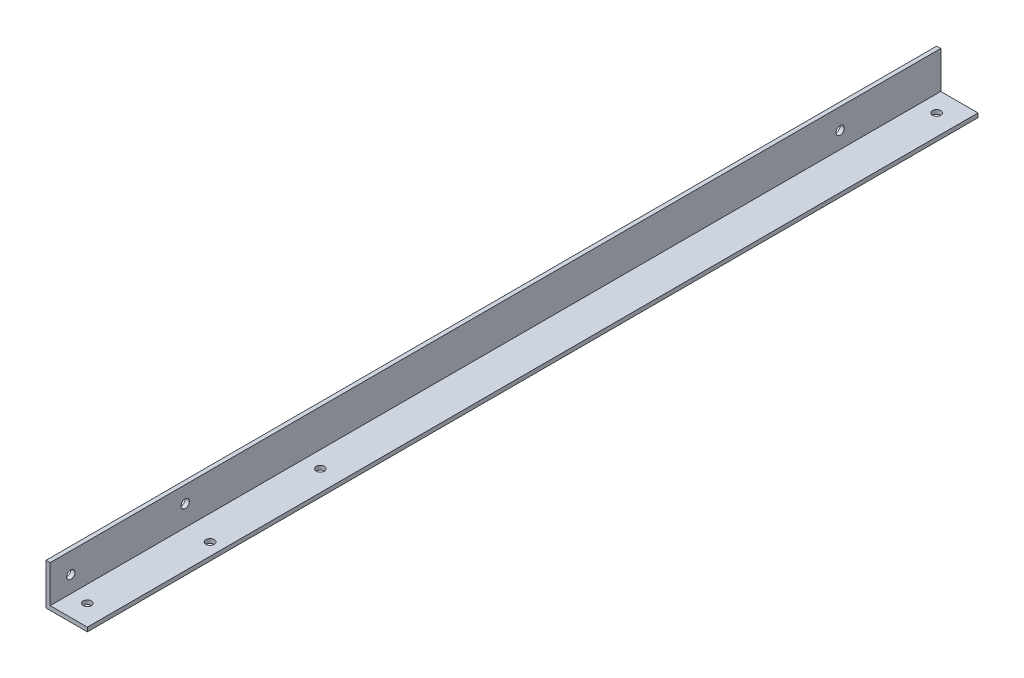
ISO-10303-21;
HEADER;
FILE_DESCRIPTION(('STEP AP214'),'2;1');
FILE_NAME('part.step','',(''),(''),'','','');
FILE_SCHEMA(('AUTOMOTIVE_DESIGN { 1 0 10303 214 1 1 1 1 }'));
ENDSEC;
DATA;
#1=APPLICATION_CONTEXT('core data for automotive mechanical design processes');
#2=APPLICATION_PROTOCOL_DEFINITION('international standard','automotive_design',2000,#1);
#3=PRODUCT_CONTEXT('',#1,'mechanical');
#4=PRODUCT('Part','Part','',(#3));
#5=PRODUCT_RELATED_PRODUCT_CATEGORY('part','',(#4));
#6=PRODUCT_DEFINITION_FORMATION('','',#4);
#7=PRODUCT_DEFINITION_CONTEXT('part definition',#1,'design');
#8=PRODUCT_DEFINITION('design','',#6,#7);
#9=PRODUCT_DEFINITION_SHAPE('','',#8);
#10=(LENGTH_UNIT() NAMED_UNIT(*) SI_UNIT(.MILLI.,.METRE.));
#11=(NAMED_UNIT(*) PLANE_ANGLE_UNIT() SI_UNIT($,.RADIAN.));
#12=(NAMED_UNIT(*) SI_UNIT($,.STERADIAN.) SOLID_ANGLE_UNIT());
#13=UNCERTAINTY_MEASURE_WITH_UNIT(LENGTH_MEASURE(1.E-05),#10,'distance_accuracy_value','');
#14=(GEOMETRIC_REPRESENTATION_CONTEXT(3) GLOBAL_UNCERTAINTY_ASSIGNED_CONTEXT((#13)) GLOBAL_UNIT_ASSIGNED_CONTEXT((#10,
#11,#12)) REPRESENTATION_CONTEXT('',''));
#15=CARTESIAN_POINT('',(0.,0.,0.));
#16=DIRECTION('',(0.,0.,1.));
#17=DIRECTION('',(1.,0.,0.));
#18=AXIS2_PLACEMENT_3D('',#15,#16,#17);
#19=CARTESIAN_POINT('',(-19.1133705903621,2.046,323.));
#20=DIRECTION('',(0.,-1.,0.));
#21=DIRECTION('',(1.,0.,0.));
#22=AXIS2_PLACEMENT_3D('',#19,#20,#21);
#23=PLANE('',#22);
#24=DIRECTION('',(-1.,0.,0.));
#25=VECTOR('',#24,1.);
#26=CARTESIAN_POINT('',(-19.1133705903621,2.046,0.));
#27=LINE('',#26,#25);
#28=CARTESIAN_POINT('',(-19.1133705903621,2.046,0.));
#29=VERTEX_POINT('',#28);
#30=CARTESIAN_POINT('',(-20.6133705903621,2.04600000000001,0.));
#31=VERTEX_POINT('',#30);
#32=EDGE_CURVE('E115',#29,#31,#27,.T.);
#33=ORIENTED_EDGE('',*,*,#32,.T.);
#34=DIRECTION('',(0.,0.,-1.));
#35=VECTOR('',#34,1.);
#36=CARTESIAN_POINT('',(-20.6133705903621,2.04600000000001,323.));
#37=LINE('',#36,#35);
#38=CARTESIAN_POINT('',(-20.6133705903621,2.04600000000001,323.));
#39=VERTEX_POINT('',#38);
#40=EDGE_CURVE('E11',#39,#31,#37,.T.);
#41=ORIENTED_EDGE('',*,*,#40,.F.);
#42=DIRECTION('',(-1.,0.,0.));
#43=VECTOR('',#42,1.);
#44=CARTESIAN_POINT('',(-19.1133705903621,2.046,323.));
#45=LINE('',#44,#43);
#46=CARTESIAN_POINT('',(-19.1133705903621,2.046,323.));
#47=VERTEX_POINT('',#46);
#48=EDGE_CURVE('E126',#47,#39,#45,.T.);
#49=ORIENTED_EDGE('',*,*,#48,.F.);
#50=DIRECTION('',(0.,0.,-1.));
#51=VECTOR('',#50,1.);
#52=CARTESIAN_POINT('',(-19.1133705903621,2.046,323.));
#53=LINE('',#52,#51);
#54=EDGE_CURVE('E111',#47,#29,#53,.T.);
#55=ORIENTED_EDGE('',*,*,#54,.T.);
#56=EDGE_LOOP('',(#33,#41,#49,#55));
#57=FACE_BOUND('',#56,.T.);
#58=ADVANCED_FACE('F31',(#57),#23,.F.);
#59=CARTESIAN_POINT('',(-20.6133705903621,2.04600000000001,323.));
#60=DIRECTION('',(1.,0.,0.));
#61=DIRECTION('',(0.,0.,-1.));
#62=AXIS2_PLACEMENT_3D('',#59,#60,#61);
#63=PLANE('',#62);
#64=CARTESIAN_POINT('',(-20.6133705903621,-5.454,315.5));
#65=DIRECTION('',(1.,0.,0.));
#66=DIRECTION('',(0.,0.,-1.));
#67=AXIS2_PLACEMENT_3D('',#64,#65,#66);
#68=CIRCLE('',#67,1.50000000000002);
#69=CARTESIAN_POINT('',(-20.6133705903621,-5.454,314.));
#70=VERTEX_POINT('',#69);
#71=EDGE_CURVE('E278',#70,#70,#68,.T.);
#72=ORIENTED_EDGE('',*,*,#71,.T.);
#73=EDGE_LOOP('',(#72));
#74=FACE_BOUND('',#73,.T.);
#75=CARTESIAN_POINT('',(-20.6133705903621,-3.954,274.));
#76=DIRECTION('',(1.,0.,0.));
#77=DIRECTION('',(0.,0.,-1.));
#78=AXIS2_PLACEMENT_3D('',#75,#76,#77);
#79=CIRCLE('',#78,1.50000000000002);
#80=CARTESIAN_POINT('',(-20.6133705903621,-3.954,272.5));
#81=VERTEX_POINT('',#80);
#82=EDGE_CURVE('E282',#81,#81,#79,.T.);
#83=ORIENTED_EDGE('',*,*,#82,.T.);
#84=EDGE_LOOP('',(#83));
#85=FACE_BOUND('',#84,.T.);
#86=CARTESIAN_POINT('',(-20.6133705903621,-5.454,36.5));
#87=DIRECTION('',(1.,0.,0.));
#88=DIRECTION('',(0.,0.,-1.));
#89=AXIS2_PLACEMENT_3D('',#86,#87,#88);
#90=CIRCLE('',#89,1.5);
#91=CARTESIAN_POINT('',(-20.6133705903621,-5.454,35.));
#92=VERTEX_POINT('',#91);
#93=EDGE_CURVE('E291',#92,#92,#90,.T.);
#94=ORIENTED_EDGE('',*,*,#93,.T.);
#95=EDGE_LOOP('',(#94));
#96=FACE_BOUND('',#95,.T.);
#97=DIRECTION('',(0.,-1.,0.));
#98=VECTOR('',#97,1.);
#99=CARTESIAN_POINT('',(-20.6133705903621,2.04600000000001,0.));
#100=LINE('',#99,#98);
#101=CARTESIAN_POINT('',(-20.6133705903621,-12.954,0.));
#102=VERTEX_POINT('',#101);
#103=EDGE_CURVE('E118',#31,#102,#100,.T.);
#104=ORIENTED_EDGE('',*,*,#103,.T.);
#105=DIRECTION('',(0.,0.,-1.));
#106=VECTOR('',#105,1.);
#107=CARTESIAN_POINT('',(-20.6133705903621,-12.954,323.));
#108=LINE('',#107,#106);
#109=CARTESIAN_POINT('',(-20.6133705903621,-12.954,323.));
#110=VERTEX_POINT('',#109);
#111=EDGE_CURVE('E39',#110,#102,#108,.T.);
#112=ORIENTED_EDGE('',*,*,#111,.F.);
#113=DIRECTION('',(0.,-1.,0.));
#114=VECTOR('',#113,1.);
#115=CARTESIAN_POINT('',(-20.6133705903621,2.04600000000001,323.));
#116=LINE('',#115,#114);
#117=EDGE_CURVE('E84',#39,#110,#116,.T.);
#118=ORIENTED_EDGE('',*,*,#117,.F.);
#119=ORIENTED_EDGE('',*,*,#40,.T.);
#120=EDGE_LOOP('',(#104,#112,#118,#119));
#121=FACE_BOUND('',#120,.T.);
#122=ADVANCED_FACE('F154',(#74,#85,#96,#121),#63,.F.);
#123=CARTESIAN_POINT('',(-20.6133705903621,-12.954,323.));
#124=DIRECTION('',(0.,1.,0.));
#125=DIRECTION('',(0.,0.,1.));
#126=AXIS2_PLACEMENT_3D('',#123,#124,#125);
#127=PLANE('',#126);
#128=CARTESIAN_POINT('',(-13.1133705903621,-12.954,231.));
#129=DIRECTION('',(0.,1.,0.));
#130=DIRECTION('',(0.,0.,1.));
#131=AXIS2_PLACEMENT_3D('',#128,#129,#130);
#132=CIRCLE('',#131,1.5);
#133=CARTESIAN_POINT('',(-13.1133705903621,-12.954,232.5));
#134=VERTEX_POINT('',#133);
#135=EDGE_CURVE('E297',#134,#134,#132,.T.);
#136=ORIENTED_EDGE('',*,*,#135,.T.);
#137=EDGE_LOOP('',(#136));
#138=FACE_BOUND('',#137,.T.);
#139=CARTESIAN_POINT('',(-10.1133705903621,-12.954,274.));
#140=DIRECTION('',(0.,1.,0.));
#141=DIRECTION('',(0.,0.,1.));
#142=AXIS2_PLACEMENT_3D('',#139,#140,#141);
#143=CIRCLE('',#142,1.5);
#144=CARTESIAN_POINT('',(-10.1133705903621,-12.954,275.5));
#145=VERTEX_POINT('',#144);
#146=EDGE_CURVE('E303',#145,#145,#143,.T.);
#147=ORIENTED_EDGE('',*,*,#146,.T.);
#148=EDGE_LOOP('',(#147));
#149=FACE_BOUND('',#148,.T.);
#150=CARTESIAN_POINT('',(-13.1133705903621,-12.954,315.5));
#151=DIRECTION('',(0.,1.,0.));
#152=DIRECTION('',(0.,0.,1.));
#153=AXIS2_PLACEMENT_3D('',#150,#151,#152);
#154=CIRCLE('',#153,1.5);
#155=CARTESIAN_POINT('',(-13.1133705903621,-12.954,317.));
#156=VERTEX_POINT('',#155);
#157=EDGE_CURVE('E309',#156,#156,#154,.T.);
#158=ORIENTED_EDGE('',*,*,#157,.T.);
#159=EDGE_LOOP('',(#158));
#160=FACE_BOUND('',#159,.T.);
#161=CARTESIAN_POINT('',(-13.1133705903621,-12.954,7.5));
#162=DIRECTION('',(0.,1.,0.));
#163=DIRECTION('',(0.,0.,1.));
#164=AXIS2_PLACEMENT_3D('',#161,#162,#163);
#165=CIRCLE('',#164,1.5);
#166=CARTESIAN_POINT('',(-13.1133705903621,-12.954,9.));
#167=VERTEX_POINT('',#166);
#168=EDGE_CURVE('E119',#167,#167,#165,.T.);
#169=ORIENTED_EDGE('',*,*,#168,.T.);
#170=EDGE_LOOP('',(#169));
#171=FACE_BOUND('',#170,.T.);
#172=DIRECTION('',(1.,0.,0.));
#173=VECTOR('',#172,1.);
#174=CARTESIAN_POINT('',(-20.6133705903621,-12.954,0.));
#175=LINE('',#174,#173);
#176=CARTESIAN_POINT('',(-5.61337059036206,-12.954,0.));
#177=VERTEX_POINT('',#176);
#178=EDGE_CURVE('E121',#102,#177,#175,.T.);
#179=ORIENTED_EDGE('',*,*,#178,.T.);
#180=DIRECTION('',(0.,0.,-1.));
#181=VECTOR('',#180,1.);
#182=CARTESIAN_POINT('',(-5.61337059036206,-12.954,323.));
#183=LINE('',#182,#181);
#184=CARTESIAN_POINT('',(-5.61337059036206,-12.954,323.));
#185=VERTEX_POINT('',#184);
#186=EDGE_CURVE('E106',#185,#177,#183,.T.);
#187=ORIENTED_EDGE('',*,*,#186,.F.);
#188=DIRECTION('',(1.,0.,0.));
#189=VECTOR('',#188,1.);
#190=CARTESIAN_POINT('',(-20.6133705903621,-12.954,323.));
#191=LINE('',#190,#189);
#192=EDGE_CURVE('E97',#110,#185,#191,.T.);
#193=ORIENTED_EDGE('',*,*,#192,.F.);
#194=ORIENTED_EDGE('',*,*,#111,.T.);
#195=EDGE_LOOP('',(#179,#187,#193,#194));
#196=FACE_BOUND('',#195,.T.);
#197=ADVANCED_FACE('F132',(#138,#149,#160,#171,#196),#127,.F.);
#198=CARTESIAN_POINT('',(-5.61337059036206,-12.954,323.));
#199=DIRECTION('',(-1.,0.,0.));
#200=DIRECTION('',(0.,0.,1.));
#201=AXIS2_PLACEMENT_3D('',#198,#199,#200);
#202=PLANE('',#201);
#203=DIRECTION('',(0.,1.,0.));
#204=VECTOR('',#203,1.);
#205=CARTESIAN_POINT('',(-5.61337059036206,-12.954,0.));
#206=LINE('',#205,#204);
#207=CARTESIAN_POINT('',(-5.61337059036206,-11.454,0.));
#208=VERTEX_POINT('',#207);
#209=EDGE_CURVE('E105',#177,#208,#206,.T.);
#210=ORIENTED_EDGE('',*,*,#209,.T.);
#211=DIRECTION('',(0.,0.,-1.));
#212=VECTOR('',#211,1.);
#213=CARTESIAN_POINT('',(-5.61337059036206,-11.454,323.));
#214=LINE('',#213,#212);
#215=CARTESIAN_POINT('',(-5.61337059036206,-11.454,323.));
#216=VERTEX_POINT('',#215);
#217=EDGE_CURVE('E102',#216,#208,#214,.T.);
#218=ORIENTED_EDGE('',*,*,#217,.F.);
#219=DIRECTION('',(0.,1.,0.));
#220=VECTOR('',#219,1.);
#221=CARTESIAN_POINT('',(-5.61337059036206,-12.954,323.));
#222=LINE('',#221,#220);
#223=EDGE_CURVE('E91',#185,#216,#222,.T.);
#224=ORIENTED_EDGE('',*,*,#223,.F.);
#225=ORIENTED_EDGE('',*,*,#186,.T.);
#226=EDGE_LOOP('',(#210,#218,#224,#225));
#227=FACE_BOUND('',#226,.T.);
#228=ADVANCED_FACE('F103',(#227),#202,.F.);
#229=CARTESIAN_POINT('',(-5.61337059036206,-11.454,323.));
#230=DIRECTION('',(0.,-1.,0.));
#231=DIRECTION('',(1.,0.,0.));
#232=AXIS2_PLACEMENT_3D('',#229,#230,#231);
#233=PLANE('',#232);
#234=CARTESIAN_POINT('',(-13.1133705903621,-11.454,231.));
#235=DIRECTION('',(0.,1.,0.));
#236=DIRECTION('',(-1.,0.,0.));
#237=AXIS2_PLACEMENT_3D('',#234,#235,#236);
#238=CIRCLE('',#237,1.5);
#239=CARTESIAN_POINT('',(-14.6133705903621,-11.454,231.));
#240=VERTEX_POINT('',#239);
#241=EDGE_CURVE('E294',#240,#240,#238,.T.);
#242=ORIENTED_EDGE('',*,*,#241,.F.);
#243=EDGE_LOOP('',(#242));
#244=FACE_BOUND('',#243,.T.);
#245=CARTESIAN_POINT('',(-10.1133705903621,-11.454,274.));
#246=DIRECTION('',(0.,1.,0.));
#247=DIRECTION('',(-1.,0.,0.));
#248=AXIS2_PLACEMENT_3D('',#245,#246,#247);
#249=CIRCLE('',#248,1.5);
#250=CARTESIAN_POINT('',(-11.6133705903621,-11.454,274.));
#251=VERTEX_POINT('',#250);
#252=EDGE_CURVE('E300',#251,#251,#249,.T.);
#253=ORIENTED_EDGE('',*,*,#252,.F.);
#254=EDGE_LOOP('',(#253));
#255=FACE_BOUND('',#254,.T.);
#256=CARTESIAN_POINT('',(-13.1133705903621,-11.454,315.5));
#257=DIRECTION('',(0.,1.,0.));
#258=DIRECTION('',(-1.,0.,0.));
#259=AXIS2_PLACEMENT_3D('',#256,#257,#258);
#260=CIRCLE('',#259,1.5);
#261=CARTESIAN_POINT('',(-14.6133705903621,-11.454,315.5));
#262=VERTEX_POINT('',#261);
#263=EDGE_CURVE('E306',#262,#262,#260,.T.);
#264=ORIENTED_EDGE('',*,*,#263,.F.);
#265=EDGE_LOOP('',(#264));
#266=FACE_BOUND('',#265,.T.);
#267=CARTESIAN_POINT('',(-13.1133705903621,-11.454,7.5));
#268=DIRECTION('',(0.,1.,0.));
#269=DIRECTION('',(-1.,0.,0.));
#270=AXIS2_PLACEMENT_3D('',#267,#268,#269);
#271=CIRCLE('',#270,1.5);
#272=CARTESIAN_POINT('',(-14.6133705903621,-11.454,7.5));
#273=VERTEX_POINT('',#272);
#274=EDGE_CURVE('E312',#273,#273,#271,.T.);
#275=ORIENTED_EDGE('',*,*,#274,.F.);
#276=EDGE_LOOP('',(#275));
#277=FACE_BOUND('',#276,.T.);
#278=DIRECTION('',(-1.,0.,0.));
#279=VECTOR('',#278,1.);
#280=CARTESIAN_POINT('',(-5.61337059036206,-11.454,0.));
#281=LINE('',#280,#279);
#282=CARTESIAN_POINT('',(-19.1133705903621,-11.454,0.));
#283=VERTEX_POINT('',#282);
#284=EDGE_CURVE('E70',#208,#283,#281,.T.);
#285=ORIENTED_EDGE('',*,*,#284,.T.);
#286=DIRECTION('',(0.,0.,-1.));
#287=VECTOR('',#286,1.);
#288=CARTESIAN_POINT('',(-19.1133705903621,-11.454,323.));
#289=LINE('',#288,#287);
#290=CARTESIAN_POINT('',(-19.1133705903621,-11.454,323.));
#291=VERTEX_POINT('',#290);
#292=EDGE_CURVE('E107',#291,#283,#289,.T.);
#293=ORIENTED_EDGE('',*,*,#292,.F.);
#294=DIRECTION('',(-1.,0.,0.));
#295=VECTOR('',#294,1.);
#296=CARTESIAN_POINT('',(-5.61337059036206,-11.454,323.));
#297=LINE('',#296,#295);
#298=EDGE_CURVE('E95',#216,#291,#297,.T.);
#299=ORIENTED_EDGE('',*,*,#298,.F.);
#300=ORIENTED_EDGE('',*,*,#217,.T.);
#301=EDGE_LOOP('',(#285,#293,#299,#300));
#302=FACE_BOUND('',#301,.T.);
#303=ADVANCED_FACE('F109',(#244,#255,#266,#277,#302),#233,.F.);
#304=CARTESIAN_POINT('',(-19.1133705903621,-11.454,323.));
#305=DIRECTION('',(-1.,0.,0.));
#306=DIRECTION('',(0.,0.,1.));
#307=AXIS2_PLACEMENT_3D('',#304,#305,#306);
#308=PLANE('',#307);
#309=CARTESIAN_POINT('',(-19.1133705903621,-5.454,315.5));
#310=DIRECTION('',(1.,0.,0.));
#311=DIRECTION('',(0.,0.,-1.));
#312=AXIS2_PLACEMENT_3D('',#309,#310,#311);
#313=CIRCLE('',#312,1.50000000000002);
#314=CARTESIAN_POINT('',(-19.1133705903621,-5.454,314.));
#315=VERTEX_POINT('',#314);
#316=EDGE_CURVE('E276',#315,#315,#313,.T.);
#317=ORIENTED_EDGE('',*,*,#316,.F.);
#318=EDGE_LOOP('',(#317));
#319=FACE_BOUND('',#318,.T.);
#320=CARTESIAN_POINT('',(-19.1133705903621,-3.954,274.));
#321=DIRECTION('',(1.,0.,0.));
#322=DIRECTION('',(0.,0.,-1.));
#323=AXIS2_PLACEMENT_3D('',#320,#321,#322);
#324=CIRCLE('',#323,1.50000000000002);
#325=CARTESIAN_POINT('',(-19.1133705903621,-3.954,272.5));
#326=VERTEX_POINT('',#325);
#327=EDGE_CURVE('E279',#326,#326,#324,.T.);
#328=ORIENTED_EDGE('',*,*,#327,.F.);
#329=EDGE_LOOP('',(#328));
#330=FACE_BOUND('',#329,.T.);
#331=CARTESIAN_POINT('',(-19.1133705903621,-5.454,36.5));
#332=DIRECTION('',(1.,0.,0.));
#333=DIRECTION('',(0.,0.,-1.));
#334=AXIS2_PLACEMENT_3D('',#331,#332,#333);
#335=CIRCLE('',#334,1.5);
#336=CARTESIAN_POINT('',(-19.1133705903621,-5.454,35.));
#337=VERTEX_POINT('',#336);
#338=EDGE_CURVE('E288',#337,#337,#335,.T.);
#339=ORIENTED_EDGE('',*,*,#338,.F.);
#340=EDGE_LOOP('',(#339));
#341=FACE_BOUND('',#340,.T.);
#342=DIRECTION('',(0.,1.,0.));
#343=VECTOR('',#342,1.);
#344=CARTESIAN_POINT('',(-19.1133705903621,-11.454,0.));
#345=LINE('',#344,#343);
#346=EDGE_CURVE('E76',#283,#29,#345,.T.);
#347=ORIENTED_EDGE('',*,*,#346,.T.);
#348=ORIENTED_EDGE('',*,*,#54,.F.);
#349=DIRECTION('',(0.,1.,0.));
#350=VECTOR('',#349,1.);
#351=CARTESIAN_POINT('',(-19.1133705903621,-11.454,323.));
#352=LINE('',#351,#350);
#353=EDGE_CURVE('E47',#291,#47,#352,.T.);
#354=ORIENTED_EDGE('',*,*,#353,.F.);
#355=ORIENTED_EDGE('',*,*,#292,.T.);
#356=EDGE_LOOP('',(#347,#348,#354,#355));
#357=FACE_BOUND('',#356,.T.);
#358=ADVANCED_FACE('F139',(#319,#330,#341,#357),#308,.F.);
#359=CARTESIAN_POINT('',(-20.6133705903621,2.04600000000001,323.));
#360=DIRECTION('',(0.,0.,1.));
#361=DIRECTION('',(1.,0.,0.));
#362=AXIS2_PLACEMENT_3D('',#359,#360,#361);
#363=PLANE('',#362);
#364=ORIENTED_EDGE('',*,*,#48,.T.);
#365=ORIENTED_EDGE('',*,*,#117,.T.);
#366=ORIENTED_EDGE('',*,*,#192,.T.);
#367=ORIENTED_EDGE('',*,*,#223,.T.);
#368=ORIENTED_EDGE('',*,*,#298,.T.);
#369=ORIENTED_EDGE('',*,*,#353,.T.);
#370=EDGE_LOOP('',(#364,#365,#366,#367,#368,#369));
#371=FACE_BOUND('',#370,.T.);
#372=ADVANCED_FACE('F93',(#371),#363,.T.);
#373=CARTESIAN_POINT('',(-20.6133705903621,2.04600000000001,0.));
#374=DIRECTION('',(0.,0.,1.));
#375=DIRECTION('',(1.,0.,0.));
#376=AXIS2_PLACEMENT_3D('',#373,#374,#375);
#377=PLANE('',#376);
#378=ORIENTED_EDGE('',*,*,#32,.F.);
#379=ORIENTED_EDGE('',*,*,#346,.F.);
#380=ORIENTED_EDGE('',*,*,#284,.F.);
#381=ORIENTED_EDGE('',*,*,#209,.F.);
#382=ORIENTED_EDGE('',*,*,#178,.F.);
#383=ORIENTED_EDGE('',*,*,#103,.F.);
#384=EDGE_LOOP('',(#378,#379,#380,#381,#382,#383));
#385=FACE_BOUND('',#384,.T.);
#386=ADVANCED_FACE('F135',(#385),#377,.F.);
#387=CARTESIAN_POINT('',(-13.113370590362,-259.454,7.5));
#388=DIRECTION('',(0.,1.,0.));
#389=DIRECTION('',(-1.,0.,0.));
#390=AXIS2_PLACEMENT_3D('',#387,#388,#389);
#391=CYLINDRICAL_SURFACE('',#390,1.5);
#392=ORIENTED_EDGE('',*,*,#274,.T.);
#393=EDGE_LOOP('',(#392));
#394=FACE_BOUND('',#393,.T.);
#395=ORIENTED_EDGE('',*,*,#168,.F.);
#396=EDGE_LOOP('',(#395));
#397=FACE_BOUND('',#396,.T.);
#398=ADVANCED_FACE('F186',(#394,#397),#391,.F.);
#399=CARTESIAN_POINT('',(-13.113370590362,-259.454,315.5));
#400=DIRECTION('',(0.,1.,0.));
#401=DIRECTION('',(-1.,0.,0.));
#402=AXIS2_PLACEMENT_3D('',#399,#400,#401);
#403=CYLINDRICAL_SURFACE('',#402,1.5);
#404=ORIENTED_EDGE('',*,*,#263,.T.);
#405=EDGE_LOOP('',(#404));
#406=FACE_BOUND('',#405,.T.);
#407=ORIENTED_EDGE('',*,*,#157,.F.);
#408=EDGE_LOOP('',(#407));
#409=FACE_BOUND('',#408,.T.);
#410=ADVANCED_FACE('F191',(#406,#409),#403,.F.);
#411=CARTESIAN_POINT('',(-10.113370590362,-259.454,274.));
#412=DIRECTION('',(0.,1.,0.));
#413=DIRECTION('',(-1.,0.,0.));
#414=AXIS2_PLACEMENT_3D('',#411,#412,#413);
#415=CYLINDRICAL_SURFACE('',#414,1.5);
#416=ORIENTED_EDGE('',*,*,#252,.T.);
#417=EDGE_LOOP('',(#416));
#418=FACE_BOUND('',#417,.T.);
#419=ORIENTED_EDGE('',*,*,#146,.F.);
#420=EDGE_LOOP('',(#419));
#421=FACE_BOUND('',#420,.T.);
#422=ADVANCED_FACE('F203',(#418,#421),#415,.F.);
#423=CARTESIAN_POINT('',(-13.113370590362,-259.454,231.));
#424=DIRECTION('',(0.,1.,0.));
#425=DIRECTION('',(-1.,0.,0.));
#426=AXIS2_PLACEMENT_3D('',#423,#424,#425);
#427=CYLINDRICAL_SURFACE('',#426,1.5);
#428=ORIENTED_EDGE('',*,*,#241,.T.);
#429=EDGE_LOOP('',(#428));
#430=FACE_BOUND('',#429,.T.);
#431=ORIENTED_EDGE('',*,*,#135,.F.);
#432=EDGE_LOOP('',(#431));
#433=FACE_BOUND('',#432,.T.);
#434=ADVANCED_FACE('F213',(#430,#433),#427,.F.);
#435=CARTESIAN_POINT('',(-267.113370590362,-5.454,36.5));
#436=DIRECTION('',(1.,0.,0.));
#437=DIRECTION('',(0.,0.,-1.));
#438=AXIS2_PLACEMENT_3D('',#435,#436,#437);
#439=CYLINDRICAL_SURFACE('',#438,1.5);
#440=ORIENTED_EDGE('',*,*,#338,.T.);
#441=EDGE_LOOP('',(#440));
#442=FACE_BOUND('',#441,.T.);
#443=ORIENTED_EDGE('',*,*,#93,.F.);
#444=EDGE_LOOP('',(#443));
#445=FACE_BOUND('',#444,.T.);
#446=ADVANCED_FACE('F222',(#442,#445),#439,.F.);
#447=CARTESIAN_POINT('',(-267.113370590362,-3.954,274.));
#448=DIRECTION('',(1.,0.,0.));
#449=DIRECTION('',(0.,0.,-1.));
#450=AXIS2_PLACEMENT_3D('',#447,#448,#449);
#451=CYLINDRICAL_SURFACE('',#450,1.50000000000002);
#452=ORIENTED_EDGE('',*,*,#327,.T.);
#453=EDGE_LOOP('',(#452));
#454=FACE_BOUND('',#453,.T.);
#455=ORIENTED_EDGE('',*,*,#82,.F.);
#456=EDGE_LOOP('',(#455));
#457=FACE_BOUND('',#456,.T.);
#458=ADVANCED_FACE('F242',(#454,#457),#451,.F.);
#459=CARTESIAN_POINT('',(-267.113370590362,-5.454,315.5));
#460=DIRECTION('',(1.,0.,0.));
#461=DIRECTION('',(0.,0.,-1.));
#462=AXIS2_PLACEMENT_3D('',#459,#460,#461);
#463=CYLINDRICAL_SURFACE('',#462,1.50000000000002);
#464=ORIENTED_EDGE('',*,*,#316,.T.);
#465=EDGE_LOOP('',(#464));
#466=FACE_BOUND('',#465,.T.);
#467=ORIENTED_EDGE('',*,*,#71,.F.);
#468=EDGE_LOOP('',(#467));
#469=FACE_BOUND('',#468,.T.);
#470=ADVANCED_FACE('F252',(#466,#469),#463,.F.);
#471=CLOSED_SHELL('',(#58,#122,#197,#228,#303,#358,#372,#386,#398,#410,#422,#434,#446,#458,#470));
#472=MANIFOLD_SOLID_BREP('B2',#471);
#473=ADVANCED_BREP_SHAPE_REPRESENTATION('',(#18,#472),#14);
#474=SHAPE_DEFINITION_REPRESENTATION(#9,#473);
ENDSEC;
END-ISO-10303-21;
